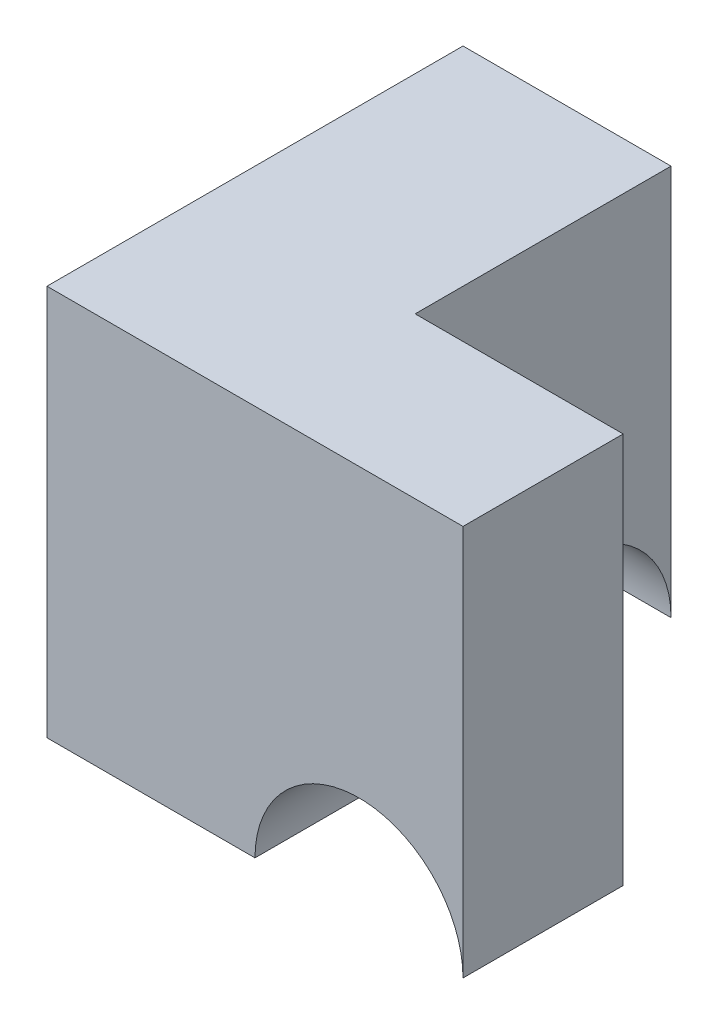
ISO-10303-21;
HEADER;
FILE_DESCRIPTION(('STEP AP214'),'2;1');
FILE_NAME('part.step','',(''),(''),'','','');
FILE_SCHEMA(('AUTOMOTIVE_DESIGN { 1 0 10303 214 1 1 1 1 }'));
ENDSEC;
DATA;
#1=APPLICATION_CONTEXT('core data for automotive mechanical design processes');
#2=APPLICATION_PROTOCOL_DEFINITION('international standard','automotive_design',2000,#1);
#3=PRODUCT_CONTEXT('',#1,'mechanical');
#4=PRODUCT('Part','Part','',(#3));
#5=PRODUCT_RELATED_PRODUCT_CATEGORY('part','',(#4));
#6=PRODUCT_DEFINITION_FORMATION('','',#4);
#7=PRODUCT_DEFINITION_CONTEXT('part definition',#1,'design');
#8=PRODUCT_DEFINITION('design','',#6,#7);
#9=PRODUCT_DEFINITION_SHAPE('','',#8);
#10=(LENGTH_UNIT() NAMED_UNIT(*) SI_UNIT(.MILLI.,.METRE.));
#11=(NAMED_UNIT(*) PLANE_ANGLE_UNIT() SI_UNIT($,.RADIAN.));
#12=(NAMED_UNIT(*) SI_UNIT($,.STERADIAN.) SOLID_ANGLE_UNIT());
#13=UNCERTAINTY_MEASURE_WITH_UNIT(LENGTH_MEASURE(1.E-05),#10,'distance_accuracy_value','');
#14=(GEOMETRIC_REPRESENTATION_CONTEXT(3) GLOBAL_UNCERTAINTY_ASSIGNED_CONTEXT((#13)) GLOBAL_UNIT_ASSIGNED_CONTEXT((#10,
#11,#12)) REPRESENTATION_CONTEXT('',''));
#15=CARTESIAN_POINT('',(0.,0.,0.));
#16=DIRECTION('',(0.,0.,1.));
#17=DIRECTION('',(1.,0.,0.));
#18=AXIS2_PLACEMENT_3D('',#15,#16,#17);
#19=CARTESIAN_POINT('',(0.,47.,19.2468990007875));
#20=DIRECTION('',(0.,0.,1.));
#21=DIRECTION('',(1.,0.,0.));
#22=AXIS2_PLACEMENT_3D('',#19,#20,#21);
#23=PLANE('',#22);
#24=CARTESIAN_POINT('',(12.5,0.,19.2468990007875));
#25=DIRECTION('',(0.,0.,1.));
#26=DIRECTION('',(1.,0.,0.));
#27=AXIS2_PLACEMENT_3D('',#24,#25,#26);
#28=CIRCLE('',#27,12.5);
#29=CARTESIAN_POINT('',(25.,0.,19.2468990007875));
#30=VERTEX_POINT('',#29);
#31=CARTESIAN_POINT('',(0.,0.,19.2468990007875));
#32=VERTEX_POINT('',#31);
#33=EDGE_CURVE('E150',#30,#32,#28,.T.);
#34=ORIENTED_EDGE('',*,*,#33,.F.);
#35=DIRECTION('',(0.,-1.,0.));
#36=VECTOR('',#35,1.);
#37=CARTESIAN_POINT('',(25.,47.,19.2468990007875));
#38=LINE('',#37,#36);
#39=CARTESIAN_POINT('',(25.,47.,19.2468990007875));
#40=VERTEX_POINT('',#39);
#41=EDGE_CURVE('E44',#40,#30,#38,.T.);
#42=ORIENTED_EDGE('',*,*,#41,.F.);
#43=DIRECTION('',(-1.,0.,0.));
#44=VECTOR('',#43,1.);
#45=CARTESIAN_POINT('',(0.,47.,19.2468990007875));
#46=LINE('',#45,#44);
#47=CARTESIAN_POINT('',(-25.,47.,19.2468990007875));
#48=VERTEX_POINT('',#47);
#49=EDGE_CURVE('E147',#40,#48,#46,.T.);
#50=ORIENTED_EDGE('',*,*,#49,.T.);
#51=DIRECTION('',(0.,-1.,0.));
#52=VECTOR('',#51,1.);
#53=CARTESIAN_POINT('',(-25.,47.,19.2468990007875));
#54=LINE('',#53,#52);
#55=CARTESIAN_POINT('',(-25.,0.,19.2468990007875));
#56=VERTEX_POINT('',#55);
#57=EDGE_CURVE('E11',#48,#56,#54,.T.);
#58=ORIENTED_EDGE('',*,*,#57,.T.);
#59=DIRECTION('',(-1.,0.,0.));
#60=VECTOR('',#59,1.);
#61=CARTESIAN_POINT('',(0.,0.,19.2468990007875));
#62=LINE('',#61,#60);
#63=EDGE_CURVE('E126',#32,#56,#62,.T.);
#64=ORIENTED_EDGE('',*,*,#63,.F.);
#65=EDGE_LOOP('',(#34,#42,#50,#58,#64));
#66=FACE_BOUND('',#65,.T.);
#67=ADVANCED_FACE('F35',(#66),#23,.T.);
#68=CARTESIAN_POINT('',(0.,0.,0.));
#69=DIRECTION('',(0.,1.,0.));
#70=DIRECTION('',(0.,0.,1.));
#71=AXIS2_PLACEMENT_3D('',#68,#69,#70);
#72=PLANE('',#71);
#73=DIRECTION('',(0.,0.,-1.));
#74=VECTOR('',#73,1.);
#75=CARTESIAN_POINT('',(-25.,0.,0.));
#76=LINE('',#75,#74);
#77=CARTESIAN_POINT('',(-25.,0.,-5.75310099921254));
#78=VERTEX_POINT('',#77);
#79=EDGE_CURVE('E123',#56,#78,#76,.T.);
#80=ORIENTED_EDGE('',*,*,#79,.T.);
#81=DIRECTION('',(-1.,0.,0.));
#82=VECTOR('',#81,1.);
#83=CARTESIAN_POINT('',(25.,0.,-5.75310099921254));
#84=LINE('',#83,#82);
#85=CARTESIAN_POINT('',(0.,0.,-5.75310099921254));
#86=VERTEX_POINT('',#85);
#87=EDGE_CURVE('E158',#78,#86,#84,.F.);
#88=ORIENTED_EDGE('',*,*,#87,.T.);
#89=DIRECTION('',(0.,0.,1.));
#90=VECTOR('',#89,1.);
#91=CARTESIAN_POINT('',(0.,0.,0.));
#92=LINE('',#91,#90);
#93=CARTESIAN_POINT('',(0.,0.,0.));
#94=VERTEX_POINT('',#93);
#95=EDGE_CURVE('E68',#86,#94,#92,.T.);
#96=ORIENTED_EDGE('',*,*,#95,.T.);
#97=DIRECTION('',(0.,0.,-1.));
#98=VECTOR('',#97,1.);
#99=CARTESIAN_POINT('',(0.,0.,125.379186736424));
#100=LINE('',#99,#98);
#101=EDGE_CURVE('E156',#32,#94,#100,.T.);
#102=ORIENTED_EDGE('',*,*,#101,.F.);
#103=ORIENTED_EDGE('',*,*,#63,.T.);
#104=EDGE_LOOP('',(#80,#88,#96,#102,#103));
#105=FACE_BOUND('',#104,.T.);
#106=ADVANCED_FACE('F168',(#105),#72,.F.);
#107=CARTESIAN_POINT('',(-25.,47.,0.));
#108=DIRECTION('',(-1.,0.,0.));
#109=DIRECTION('',(0.,0.,1.));
#110=AXIS2_PLACEMENT_3D('',#107,#108,#109);
#111=PLANE('',#110);
#112=CARTESIAN_POINT('',(-25.,0.,-18.2531009992125));
#113=DIRECTION('',(-1.,0.,0.));
#114=DIRECTION('',(0.,0.,1.));
#115=AXIS2_PLACEMENT_3D('',#112,#113,#114);
#116=CIRCLE('',#115,12.5);
#117=CARTESIAN_POINT('',(-25.,0.,-30.7531009992125));
#118=VERTEX_POINT('',#117);
#119=EDGE_CURVE('E76',#78,#118,#116,.T.);
#120=ORIENTED_EDGE('',*,*,#119,.F.);
#121=ORIENTED_EDGE('',*,*,#79,.F.);
#122=ORIENTED_EDGE('',*,*,#57,.F.);
#123=DIRECTION('',(0.,0.,-1.));
#124=VECTOR('',#123,1.);
#125=CARTESIAN_POINT('',(-25.,47.,0.));
#126=LINE('',#125,#124);
#127=CARTESIAN_POINT('',(-25.,47.,-30.7531009992125));
#128=VERTEX_POINT('',#127);
#129=EDGE_CURVE('E135',#48,#128,#126,.T.);
#130=ORIENTED_EDGE('',*,*,#129,.T.);
#131=DIRECTION('',(0.,-1.,0.));
#132=VECTOR('',#131,1.);
#133=CARTESIAN_POINT('',(-25.,47.,-30.7531009992125));
#134=LINE('',#133,#132);
#135=EDGE_CURVE('E119',#128,#118,#134,.T.);
#136=ORIENTED_EDGE('',*,*,#135,.T.);
#137=EDGE_LOOP('',(#120,#121,#122,#130,#136));
#138=FACE_BOUND('',#137,.T.);
#139=ADVANCED_FACE('F37',(#138),#111,.T.);
#140=CARTESIAN_POINT('',(25.,47.,0.));
#141=DIRECTION('',(1.,0.,0.));
#142=DIRECTION('',(0.,0.,-1.));
#143=AXIS2_PLACEMENT_3D('',#140,#141,#142);
#144=PLANE('',#143);
#145=DIRECTION('',(0.,0.,1.));
#146=VECTOR('',#145,1.);
#147=CARTESIAN_POINT('',(25.,0.,0.));
#148=LINE('',#147,#146);
#149=CARTESIAN_POINT('',(25.,0.,0.));
#150=VERTEX_POINT('',#149);
#151=EDGE_CURVE('E128',#150,#30,#148,.T.);
#152=ORIENTED_EDGE('',*,*,#151,.F.);
#153=DIRECTION('',(0.,-1.,0.));
#154=VECTOR('',#153,1.);
#155=CARTESIAN_POINT('',(25.,47.,0.));
#156=LINE('',#155,#154);
#157=CARTESIAN_POINT('',(25.,47.,0.));
#158=VERTEX_POINT('',#157);
#159=EDGE_CURVE('E105',#158,#150,#156,.T.);
#160=ORIENTED_EDGE('',*,*,#159,.F.);
#161=DIRECTION('',(0.,0.,1.));
#162=VECTOR('',#161,1.);
#163=CARTESIAN_POINT('',(25.,47.,0.));
#164=LINE('',#163,#162);
#165=EDGE_CURVE('E113',#158,#40,#164,.T.);
#166=ORIENTED_EDGE('',*,*,#165,.T.);
#167=ORIENTED_EDGE('',*,*,#41,.T.);
#168=EDGE_LOOP('',(#152,#160,#166,#167));
#169=FACE_BOUND('',#168,.T.);
#170=ADVANCED_FACE('F142',(#169),#144,.T.);
#171=CARTESIAN_POINT('',(0.,47.,0.));
#172=DIRECTION('',(0.,0.,-1.));
#173=DIRECTION('',(-1.,0.,0.));
#174=AXIS2_PLACEMENT_3D('',#171,#172,#173);
#175=PLANE('',#174);
#176=ORIENTED_EDGE('',*,*,#159,.T.);
#177=CARTESIAN_POINT('',(12.5,0.,0.));
#178=DIRECTION('',(0.,0.,-1.));
#179=DIRECTION('',(-1.,0.,0.));
#180=AXIS2_PLACEMENT_3D('',#177,#178,#179);
#181=CIRCLE('',#180,12.5);
#182=EDGE_CURVE('E102',#150,#94,#181,.F.);
#183=ORIENTED_EDGE('',*,*,#182,.T.);
#184=DIRECTION('',(0.,-1.,0.));
#185=VECTOR('',#184,1.);
#186=CARTESIAN_POINT('',(0.,47.,0.));
#187=LINE('',#186,#185);
#188=CARTESIAN_POINT('',(0.,47.,0.));
#189=VERTEX_POINT('',#188);
#190=EDGE_CURVE('E96',#189,#94,#187,.T.);
#191=ORIENTED_EDGE('',*,*,#190,.F.);
#192=DIRECTION('',(1.,0.,0.));
#193=VECTOR('',#192,1.);
#194=CARTESIAN_POINT('',(0.,47.,0.));
#195=LINE('',#194,#193);
#196=EDGE_CURVE('E100',#189,#158,#195,.T.);
#197=ORIENTED_EDGE('',*,*,#196,.T.);
#198=EDGE_LOOP('',(#176,#183,#191,#197));
#199=FACE_BOUND('',#198,.T.);
#200=ADVANCED_FACE('F99',(#199),#175,.T.);
#201=CARTESIAN_POINT('',(0.,47.,0.));
#202=DIRECTION('',(1.,0.,0.));
#203=DIRECTION('',(0.,0.,-1.));
#204=AXIS2_PLACEMENT_3D('',#201,#202,#203);
#205=PLANE('',#204);
#206=CARTESIAN_POINT('',(0.,0.,-18.2531009992125));
#207=DIRECTION('',(1.,0.,0.));
#208=DIRECTION('',(0.,0.,-1.));
#209=AXIS2_PLACEMENT_3D('',#206,#207,#208);
#210=CIRCLE('',#209,12.5);
#211=CARTESIAN_POINT('',(0.,0.,-30.7531009992125));
#212=VERTEX_POINT('',#211);
#213=EDGE_CURVE('E160',#212,#86,#210,.T.);
#214=ORIENTED_EDGE('',*,*,#213,.F.);
#215=DIRECTION('',(0.,-1.,0.));
#216=VECTOR('',#215,1.);
#217=CARTESIAN_POINT('',(0.,47.,-30.7531009992125));
#218=LINE('',#217,#216);
#219=CARTESIAN_POINT('',(0.,47.,-30.7531009992125));
#220=VERTEX_POINT('',#219);
#221=EDGE_CURVE('E106',#220,#212,#218,.T.);
#222=ORIENTED_EDGE('',*,*,#221,.F.);
#223=DIRECTION('',(0.,0.,1.));
#224=VECTOR('',#223,1.);
#225=CARTESIAN_POINT('',(0.,47.,0.));
#226=LINE('',#225,#224);
#227=EDGE_CURVE('E110',#220,#189,#226,.T.);
#228=ORIENTED_EDGE('',*,*,#227,.T.);
#229=ORIENTED_EDGE('',*,*,#190,.T.);
#230=ORIENTED_EDGE('',*,*,#95,.F.);
#231=EDGE_LOOP('',(#214,#222,#228,#229,#230));
#232=FACE_BOUND('',#231,.T.);
#233=ADVANCED_FACE('F116',(#232),#205,.T.);
#234=CARTESIAN_POINT('',(0.,47.,-30.7531009992125));
#235=DIRECTION('',(0.,0.,1.));
#236=DIRECTION('',(1.,0.,0.));
#237=AXIS2_PLACEMENT_3D('',#234,#235,#236);
#238=PLANE('',#237);
#239=DIRECTION('',(-1.,0.,0.));
#240=VECTOR('',#239,1.);
#241=CARTESIAN_POINT('',(0.,0.,-30.7531009992125));
#242=LINE('',#241,#240);
#243=EDGE_CURVE('E132',#212,#118,#242,.T.);
#244=ORIENTED_EDGE('',*,*,#243,.T.);
#245=ORIENTED_EDGE('',*,*,#135,.F.);
#246=DIRECTION('',(-1.,0.,0.));
#247=VECTOR('',#246,1.);
#248=CARTESIAN_POINT('',(0.,47.,-30.7531009992125));
#249=LINE('',#248,#247);
#250=EDGE_CURVE('E52',#220,#128,#249,.T.);
#251=ORIENTED_EDGE('',*,*,#250,.F.);
#252=ORIENTED_EDGE('',*,*,#221,.T.);
#253=EDGE_LOOP('',(#244,#245,#251,#252));
#254=FACE_BOUND('',#253,.T.);
#255=ADVANCED_FACE('F171',(#254),#238,.F.);
#256=CARTESIAN_POINT('',(0.,47.,0.));
#257=DIRECTION('',(0.,1.,0.));
#258=DIRECTION('',(0.,0.,1.));
#259=AXIS2_PLACEMENT_3D('',#256,#257,#258);
#260=PLANE('',#259);
#261=ORIENTED_EDGE('',*,*,#129,.F.);
#262=ORIENTED_EDGE('',*,*,#49,.F.);
#263=ORIENTED_EDGE('',*,*,#165,.F.);
#264=ORIENTED_EDGE('',*,*,#196,.F.);
#265=ORIENTED_EDGE('',*,*,#227,.F.);
#266=ORIENTED_EDGE('',*,*,#250,.T.);
#267=EDGE_LOOP('',(#261,#262,#263,#264,#265,#266));
#268=FACE_BOUND('',#267,.T.);
#269=ADVANCED_FACE('F109',(#268),#260,.T.);
#270=CARTESIAN_POINT('',(12.5,0.,125.379186736424));
#271=DIRECTION('',(0.,0.,-1.));
#272=DIRECTION('',(-1.,0.,0.));
#273=AXIS2_PLACEMENT_3D('',#270,#271,#272);
#274=CYLINDRICAL_SURFACE('',#273,12.5);
#275=ORIENTED_EDGE('',*,*,#182,.F.);
#276=ORIENTED_EDGE('',*,*,#151,.T.);
#277=ORIENTED_EDGE('',*,*,#33,.T.);
#278=ORIENTED_EDGE('',*,*,#101,.T.);
#279=EDGE_LOOP('',(#275,#276,#277,#278));
#280=FACE_BOUND('',#279,.T.);
#281=ADVANCED_FACE('F175',(#280),#274,.F.);
#282=CARTESIAN_POINT('',(25.,0.,-18.2531009992125));
#283=DIRECTION('',(-1.,0.,0.));
#284=DIRECTION('',(0.,0.,1.));
#285=AXIS2_PLACEMENT_3D('',#282,#283,#284);
#286=CYLINDRICAL_SURFACE('',#285,12.5);
#287=ORIENTED_EDGE('',*,*,#119,.T.);
#288=ORIENTED_EDGE('',*,*,#243,.F.);
#289=ORIENTED_EDGE('',*,*,#213,.T.);
#290=ORIENTED_EDGE('',*,*,#87,.F.);
#291=EDGE_LOOP('',(#287,#288,#289,#290));
#292=FACE_BOUND('',#291,.T.);
#293=ADVANCED_FACE('F164',(#292),#286,.F.);
#294=CLOSED_SHELL('',(#67,#106,#139,#170,#200,#233,#255,#269,#281,#293));
#295=MANIFOLD_SOLID_BREP('B2',#294);
#296=ADVANCED_BREP_SHAPE_REPRESENTATION('',(#18,#295),#14);
#297=SHAPE_DEFINITION_REPRESENTATION(#9,#296);
ENDSEC;
END-ISO-10303-21;
